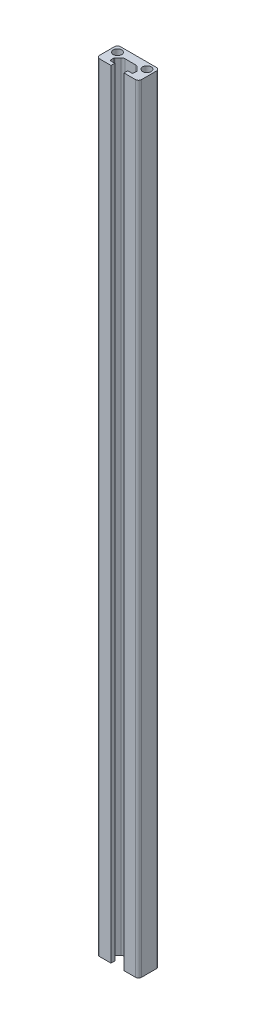
ISO-10303-21;
HEADER;
FILE_DESCRIPTION(('STEP AP214'),'2;1');
FILE_NAME('part.step','',(''),(''),'','','');
FILE_SCHEMA(('AUTOMOTIVE_DESIGN { 1 0 10303 214 1 1 1 1 }'));
ENDSEC;
DATA;
#1=APPLICATION_CONTEXT('core data for automotive mechanical design processes');
#2=APPLICATION_PROTOCOL_DEFINITION('international standard','automotive_design',2000,#1);
#3=PRODUCT_CONTEXT('',#1,'mechanical');
#4=PRODUCT('Part','Part','',(#3));
#5=PRODUCT_RELATED_PRODUCT_CATEGORY('part','',(#4));
#6=PRODUCT_DEFINITION_FORMATION('','',#4);
#7=PRODUCT_DEFINITION_CONTEXT('part definition',#1,'design');
#8=PRODUCT_DEFINITION('design','',#6,#7);
#9=PRODUCT_DEFINITION_SHAPE('','',#8);
#10=(LENGTH_UNIT() NAMED_UNIT(*) SI_UNIT(.MILLI.,.METRE.));
#11=(NAMED_UNIT(*) PLANE_ANGLE_UNIT() SI_UNIT($,.RADIAN.));
#12=(NAMED_UNIT(*) SI_UNIT($,.STERADIAN.) SOLID_ANGLE_UNIT());
#13=UNCERTAINTY_MEASURE_WITH_UNIT(LENGTH_MEASURE(1.E-05),#10,'distance_accuracy_value','');
#14=(GEOMETRIC_REPRESENTATION_CONTEXT(3) GLOBAL_UNCERTAINTY_ASSIGNED_CONTEXT((#13)) GLOBAL_UNIT_ASSIGNED_CONTEXT((#10,
#11,#12)) REPRESENTATION_CONTEXT('',''));
#15=CARTESIAN_POINT('',(0.,0.,0.));
#16=DIRECTION('',(0.,0.,1.));
#17=DIRECTION('',(1.,0.,0.));
#18=AXIS2_PLACEMENT_3D('',#15,#16,#17);
#19=CARTESIAN_POINT('',(-8.5,185.,0.));
#20=DIRECTION('',(0.,0.,-1.));
#21=DIRECTION('',(-1.,0.,0.));
#22=AXIS2_PLACEMENT_3D('',#19,#20,#21);
#23=PLANE('',#22);
#24=DIRECTION('',(1.,0.,0.));
#25=VECTOR('',#24,1.);
#26=CARTESIAN_POINT('',(-8.5,-185.,0.));
#27=LINE('',#26,#25);
#28=CARTESIAN_POINT('',(-8.5,-185.,0.));
#29=VERTEX_POINT('',#28);
#30=CARTESIAN_POINT('',(-3.1,-185.,0.));
#31=VERTEX_POINT('',#30);
#32=EDGE_CURVE('E260',#29,#31,#27,.T.);
#33=ORIENTED_EDGE('',*,*,#32,.T.);
#34=DIRECTION('',(0.,1.,0.));
#35=VECTOR('',#34,1.);
#36=CARTESIAN_POINT('',(-3.1,-185.,0.));
#37=LINE('',#36,#35);
#38=CARTESIAN_POINT('',(-3.1,185.,0.));
#39=VERTEX_POINT('',#38);
#40=EDGE_CURVE('E217',#31,#39,#37,.T.);
#41=ORIENTED_EDGE('',*,*,#40,.T.);
#42=DIRECTION('',(1.,0.,0.));
#43=VECTOR('',#42,1.);
#44=CARTESIAN_POINT('',(-8.5,185.,0.));
#45=LINE('',#44,#43);
#46=CARTESIAN_POINT('',(-8.5,185.,0.));
#47=VERTEX_POINT('',#46);
#48=EDGE_CURVE('E200',#47,#39,#45,.T.);
#49=ORIENTED_EDGE('',*,*,#48,.F.);
#50=DIRECTION('',(0.,-1.,0.));
#51=VECTOR('',#50,1.);
#52=CARTESIAN_POINT('',(-8.5,185.,0.));
#53=LINE('',#52,#51);
#54=EDGE_CURVE('E284',#47,#29,#53,.T.);
#55=ORIENTED_EDGE('',*,*,#54,.T.);
#56=EDGE_LOOP('',(#33,#41,#49,#55));
#57=FACE_BOUND('',#56,.T.);
#58=ADVANCED_FACE('F17',(#57),#23,.F.);
#59=CARTESIAN_POINT('',(-8.5,185.,-8.5));
#60=DIRECTION('',(0.,1.,0.));
#61=DIRECTION('',(0.,0.,1.));
#62=AXIS2_PLACEMENT_3D('',#59,#60,#61);
#63=PLANE('',#62);
#64=DIRECTION('',(1.,0.,0.));
#65=VECTOR('',#64,1.);
#66=CARTESIAN_POINT('',(-5.45,185.,-1.8));
#67=LINE('',#66,#65);
#68=CARTESIAN_POINT('',(-4.95,185.,-1.8));
#69=VERTEX_POINT('',#68);
#70=CARTESIAN_POINT('',(-3.1,185.,-1.8));
#71=VERTEX_POINT('',#70);
#72=EDGE_CURVE('E177',#69,#71,#67,.T.);
#73=ORIENTED_EDGE('',*,*,#72,.F.);
#74=CARTESIAN_POINT('',(-4.95,185.,-2.3));
#75=DIRECTION('',(0.,1.,0.));
#76=DIRECTION('',(0.,0.,1.));
#77=AXIS2_PLACEMENT_3D('',#74,#75,#76);
#78=CIRCLE('',#77,0.5);
#79=CARTESIAN_POINT('',(-5.45,185.,-2.3));
#80=VERTEX_POINT('',#79);
#81=EDGE_CURVE('E25',#69,#80,#78,.F.);
#82=ORIENTED_EDGE('',*,*,#81,.T.);
#83=DIRECTION('',(0.,0.,1.));
#84=VECTOR('',#83,1.);
#85=CARTESIAN_POINT('',(-5.45,185.,-3.9));
#86=LINE('',#85,#84);
#87=CARTESIAN_POINT('',(-5.45,185.,-3.69289321881346));
#88=VERTEX_POINT('',#87);
#89=EDGE_CURVE('E347',#88,#80,#86,.T.);
#90=ORIENTED_EDGE('',*,*,#89,.F.);
#91=CARTESIAN_POINT('',(-4.95,185.,-3.69289321881346));
#92=DIRECTION('',(0.,1.,0.));
#93=DIRECTION('',(0.,0.,1.));
#94=AXIS2_PLACEMENT_3D('',#91,#92,#93);
#95=CIRCLE('',#94,0.5);
#96=CARTESIAN_POINT('',(-5.30355339059327,185.,-4.04644660940673));
#97=VERTEX_POINT('',#96);
#98=EDGE_CURVE('E342',#88,#97,#95,.F.);
#99=ORIENTED_EDGE('',*,*,#98,.T.);
#100=DIRECTION('',(-0.707106781186548,0.,0.707106781186548));
#101=VECTOR('',#100,1.);
#102=CARTESIAN_POINT('',(-5.45,185.,-3.9));
#103=LINE('',#102,#101);
#104=CARTESIAN_POINT('',(-3.83578643762691,185.,-5.5142135623731));
#105=VERTEX_POINT('',#104);
#106=EDGE_CURVE('E352',#105,#97,#103,.T.);
#107=ORIENTED_EDGE('',*,*,#106,.F.);
#108=CARTESIAN_POINT('',(-2.42157287525381,185.,-4.1));
#109=DIRECTION('',(0.,1.,0.));
#110=DIRECTION('',(0.,0.,1.));
#111=AXIS2_PLACEMENT_3D('',#108,#109,#110);
#112=CIRCLE('',#111,2.);
#113=CARTESIAN_POINT('',(-2.42157287525381,185.,-6.1));
#114=VERTEX_POINT('',#113);
#115=EDGE_CURVE('E312',#105,#114,#112,.F.);
#116=ORIENTED_EDGE('',*,*,#115,.T.);
#117=DIRECTION('',(-1.,0.,0.));
#118=VECTOR('',#117,1.);
#119=CARTESIAN_POINT('',(-3.1,185.,-6.1));
#120=LINE('',#119,#118);
#121=CARTESIAN_POINT('',(2.42157287525381,185.,-6.1));
#122=VERTEX_POINT('',#121);
#123=EDGE_CURVE('E204',#122,#114,#120,.T.);
#124=ORIENTED_EDGE('',*,*,#123,.F.);
#125=CARTESIAN_POINT('',(2.42157287525381,185.,-4.1));
#126=DIRECTION('',(0.,1.,0.));
#127=DIRECTION('',(0.,0.,1.));
#128=AXIS2_PLACEMENT_3D('',#125,#126,#127);
#129=CIRCLE('',#128,2.);
#130=CARTESIAN_POINT('',(3.83578643762691,185.,-5.5142135623731));
#131=VERTEX_POINT('',#130);
#132=EDGE_CURVE('E307',#122,#131,#129,.F.);
#133=ORIENTED_EDGE('',*,*,#132,.T.);
#134=DIRECTION('',(-0.707106781186548,0.,-0.707106781186548));
#135=VECTOR('',#134,1.);
#136=CARTESIAN_POINT('',(3.25,185.,-6.1));
#137=LINE('',#136,#135);
#138=CARTESIAN_POINT('',(5.30355339059327,185.,-4.04644660940673));
#139=VERTEX_POINT('',#138);
#140=EDGE_CURVE('E441',#139,#131,#137,.T.);
#141=ORIENTED_EDGE('',*,*,#140,.F.);
#142=CARTESIAN_POINT('',(4.95,185.,-3.69289321881346));
#143=DIRECTION('',(0.,1.,0.));
#144=DIRECTION('',(0.,0.,1.));
#145=AXIS2_PLACEMENT_3D('',#142,#143,#144);
#146=CIRCLE('',#145,0.5);
#147=CARTESIAN_POINT('',(5.45,185.,-3.69289321881346));
#148=VERTEX_POINT('',#147);
#149=EDGE_CURVE('E334',#139,#148,#146,.F.);
#150=ORIENTED_EDGE('',*,*,#149,.T.);
#151=DIRECTION('',(0.,0.,-1.));
#152=VECTOR('',#151,1.);
#153=CARTESIAN_POINT('',(5.45,185.,-3.9));
#154=LINE('',#153,#152);
#155=CARTESIAN_POINT('',(5.45,185.,-2.3));
#156=VERTEX_POINT('',#155);
#157=EDGE_CURVE('E443',#156,#148,#154,.T.);
#158=ORIENTED_EDGE('',*,*,#157,.F.);
#159=CARTESIAN_POINT('',(4.95,185.,-2.3));
#160=DIRECTION('',(0.,1.,0.));
#161=DIRECTION('',(0.,0.,1.));
#162=AXIS2_PLACEMENT_3D('',#159,#160,#161);
#163=CIRCLE('',#162,0.5);
#164=CARTESIAN_POINT('',(4.95,185.,-1.8));
#165=VERTEX_POINT('',#164);
#166=EDGE_CURVE('E338',#156,#165,#163,.F.);
#167=ORIENTED_EDGE('',*,*,#166,.T.);
#168=CARTESIAN_POINT('',(3.1,185.,-1.8));
#169=VERTEX_POINT('',#168);
#170=EDGE_CURVE('E186',#169,#165,#67,.T.);
#171=ORIENTED_EDGE('',*,*,#170,.F.);
#172=DIRECTION('',(0.,0.,-1.));
#173=VECTOR('',#172,1.);
#174=CARTESIAN_POINT('',(3.1,185.,-6.1));
#175=LINE('',#174,#173);
#176=CARTESIAN_POINT('',(3.1,185.,0.));
#177=VERTEX_POINT('',#176);
#178=EDGE_CURVE('E201',#177,#169,#175,.T.);
#179=ORIENTED_EDGE('',*,*,#178,.F.);
#180=CARTESIAN_POINT('',(8.5,185.,0.));
#181=VERTEX_POINT('',#180);
#182=EDGE_CURVE('E242',#177,#181,#45,.T.);
#183=ORIENTED_EDGE('',*,*,#182,.T.);
#184=CARTESIAN_POINT('',(8.5,185.,-1.5));
#185=DIRECTION('',(0.,1.,0.));
#186=DIRECTION('',(0.,0.,1.));
#187=AXIS2_PLACEMENT_3D('',#184,#185,#186);
#188=CIRCLE('',#187,1.5);
#189=CARTESIAN_POINT('',(10.,185.,-1.5));
#190=VERTEX_POINT('',#189);
#191=EDGE_CURVE('E244',#181,#190,#188,.T.);
#192=ORIENTED_EDGE('',*,*,#191,.T.);
#193=DIRECTION('',(0.,0.,-1.));
#194=VECTOR('',#193,1.);
#195=CARTESIAN_POINT('',(10.,185.,-8.5));
#196=LINE('',#195,#194);
#197=CARTESIAN_POINT('',(10.,185.,-8.5));
#198=VERTEX_POINT('',#197);
#199=EDGE_CURVE('E246',#190,#198,#196,.T.);
#200=ORIENTED_EDGE('',*,*,#199,.T.);
#201=CARTESIAN_POINT('',(8.5,185.,-8.5));
#202=DIRECTION('',(0.,1.,0.));
#203=DIRECTION('',(0.,0.,-1.));
#204=AXIS2_PLACEMENT_3D('',#201,#202,#203);
#205=CIRCLE('',#204,1.5);
#206=CARTESIAN_POINT('',(8.5,185.,-10.));
#207=VERTEX_POINT('',#206);
#208=EDGE_CURVE('E248',#198,#207,#205,.T.);
#209=ORIENTED_EDGE('',*,*,#208,.T.);
#210=DIRECTION('',(-1.,0.,0.));
#211=VECTOR('',#210,1.);
#212=CARTESIAN_POINT('',(-8.5,185.,-10.));
#213=LINE('',#212,#211);
#214=CARTESIAN_POINT('',(-8.5,185.,-10.));
#215=VERTEX_POINT('',#214);
#216=EDGE_CURVE('E250',#207,#215,#213,.T.);
#217=ORIENTED_EDGE('',*,*,#216,.T.);
#218=CARTESIAN_POINT('',(-8.5,185.,-8.5));
#219=DIRECTION('',(0.,1.,0.));
#220=DIRECTION('',(0.,0.,1.));
#221=AXIS2_PLACEMENT_3D('',#218,#219,#220);
#222=CIRCLE('',#221,1.5);
#223=CARTESIAN_POINT('',(-10.,185.,-8.5));
#224=VERTEX_POINT('',#223);
#225=EDGE_CURVE('E234',#215,#224,#222,.T.);
#226=ORIENTED_EDGE('',*,*,#225,.T.);
#227=DIRECTION('',(0.,0.,1.));
#228=VECTOR('',#227,1.);
#229=CARTESIAN_POINT('',(-10.,185.,-8.5));
#230=LINE('',#229,#228);
#231=CARTESIAN_POINT('',(-10.,185.,-1.5));
#232=VERTEX_POINT('',#231);
#233=EDGE_CURVE('E237',#224,#232,#230,.T.);
#234=ORIENTED_EDGE('',*,*,#233,.T.);
#235=CARTESIAN_POINT('',(-8.5,185.,-1.5));
#236=DIRECTION('',(0.,1.,0.));
#237=DIRECTION('',(0.,0.,1.));
#238=AXIS2_PLACEMENT_3D('',#235,#236,#237);
#239=CIRCLE('',#238,1.5);
#240=EDGE_CURVE('E240',#232,#47,#239,.T.);
#241=ORIENTED_EDGE('',*,*,#240,.T.);
#242=ORIENTED_EDGE('',*,*,#48,.T.);
#243=DIRECTION('',(0.,0.,1.));
#244=VECTOR('',#243,1.);
#245=CARTESIAN_POINT('',(-3.1,185.,-6.1));
#246=LINE('',#245,#244);
#247=EDGE_CURVE('E191',#71,#39,#246,.T.);
#248=ORIENTED_EDGE('',*,*,#247,.F.);
#249=EDGE_LOOP('',(#73,#82,#90,#99,#107,#116,#124,#133,#141,#150,#158,#167,#171,#179,#183,#192,
#200,#209,#217,#226,#234,#241,#242,#248));
#250=FACE_BOUND('',#249,.T.);
#251=CARTESIAN_POINT('',(-7.,185.,-7.));
#252=DIRECTION('',(0.,1.,0.));
#253=DIRECTION('',(0.,0.,1.));
#254=AXIS2_PLACEMENT_3D('',#251,#252,#253);
#255=CIRCLE('',#254,2.);
#256=CARTESIAN_POINT('',(-7.,185.,-5.));
#257=VERTEX_POINT('',#256);
#258=EDGE_CURVE('E228',#257,#257,#255,.T.);
#259=ORIENTED_EDGE('',*,*,#258,.F.);
#260=EDGE_LOOP('',(#259));
#261=FACE_BOUND('',#260,.T.);
#262=CARTESIAN_POINT('',(7.,185.,-7.));
#263=DIRECTION('',(0.,1.,0.));
#264=DIRECTION('',(0.,0.,1.));
#265=AXIS2_PLACEMENT_3D('',#262,#263,#264);
#266=CIRCLE('',#265,2.);
#267=CARTESIAN_POINT('',(7.,185.,-5.));
#268=VERTEX_POINT('',#267);
#269=EDGE_CURVE('E222',#268,#268,#266,.T.);
#270=ORIENTED_EDGE('',*,*,#269,.F.);
#271=EDGE_LOOP('',(#270));
#272=FACE_BOUND('',#271,.T.);
#273=ADVANCED_FACE('F197',(#250,#261,#272),#63,.T.);
#274=CARTESIAN_POINT('',(-8.5,-185.,-8.5));
#275=DIRECTION('',(0.,1.,0.));
#276=DIRECTION('',(0.,0.,1.));
#277=AXIS2_PLACEMENT_3D('',#274,#275,#276);
#278=PLANE('',#277);
#279=DIRECTION('',(-0.707106781186548,0.,0.707106781186548));
#280=VECTOR('',#279,1.);
#281=CARTESIAN_POINT('',(-5.45,-185.,-3.9));
#282=LINE('',#281,#280);
#283=CARTESIAN_POINT('',(-3.83578643762691,-185.,-5.5142135623731));
#284=VERTEX_POINT('',#283);
#285=CARTESIAN_POINT('',(-5.30355339059327,-185.,-4.04644660940673));
#286=VERTEX_POINT('',#285);
#287=EDGE_CURVE('E433',#284,#286,#282,.T.);
#288=ORIENTED_EDGE('',*,*,#287,.T.);
#289=CARTESIAN_POINT('',(-4.95,-185.,-3.69289321881346));
#290=DIRECTION('',(0.,1.,0.));
#291=DIRECTION('',(0.,0.,1.));
#292=AXIS2_PLACEMENT_3D('',#289,#290,#291);
#293=CIRCLE('',#292,0.5);
#294=CARTESIAN_POINT('',(-5.45,-185.,-3.69289321881346));
#295=VERTEX_POINT('',#294);
#296=EDGE_CURVE('E344',#286,#295,#293,.T.);
#297=ORIENTED_EDGE('',*,*,#296,.T.);
#298=DIRECTION('',(0.,0.,1.));
#299=VECTOR('',#298,1.);
#300=CARTESIAN_POINT('',(-5.45,-185.,-3.9));
#301=LINE('',#300,#299);
#302=CARTESIAN_POINT('',(-5.45,-185.,-2.3));
#303=VERTEX_POINT('',#302);
#304=EDGE_CURVE('E430',#295,#303,#301,.T.);
#305=ORIENTED_EDGE('',*,*,#304,.T.);
#306=CARTESIAN_POINT('',(-4.95,-185.,-2.3));
#307=DIRECTION('',(0.,1.,0.));
#308=DIRECTION('',(0.,0.,1.));
#309=AXIS2_PLACEMENT_3D('',#306,#307,#308);
#310=CIRCLE('',#309,0.5);
#311=CARTESIAN_POINT('',(-4.95,-185.,-1.8));
#312=VERTEX_POINT('',#311);
#313=EDGE_CURVE('E11',#303,#312,#310,.T.);
#314=ORIENTED_EDGE('',*,*,#313,.T.);
#315=DIRECTION('',(1.,0.,0.));
#316=VECTOR('',#315,1.);
#317=CARTESIAN_POINT('',(-5.45,-185.,-1.8));
#318=LINE('',#317,#316);
#319=CARTESIAN_POINT('',(-3.1,-185.,-1.8));
#320=VERTEX_POINT('',#319);
#321=EDGE_CURVE('E194',#312,#320,#318,.T.);
#322=ORIENTED_EDGE('',*,*,#321,.T.);
#323=DIRECTION('',(0.,0.,1.));
#324=VECTOR('',#323,1.);
#325=CARTESIAN_POINT('',(-3.1,-185.,-6.1));
#326=LINE('',#325,#324);
#327=EDGE_CURVE('E193',#320,#31,#326,.T.);
#328=ORIENTED_EDGE('',*,*,#327,.T.);
#329=ORIENTED_EDGE('',*,*,#32,.F.);
#330=CARTESIAN_POINT('',(-8.5,-185.,-1.5));
#331=DIRECTION('',(0.,1.,0.));
#332=DIRECTION('',(0.,0.,1.));
#333=AXIS2_PLACEMENT_3D('',#330,#331,#332);
#334=CIRCLE('',#333,1.5);
#335=CARTESIAN_POINT('',(-10.,-185.,-1.5));
#336=VERTEX_POINT('',#335);
#337=EDGE_CURVE('E257',#336,#29,#334,.T.);
#338=ORIENTED_EDGE('',*,*,#337,.F.);
#339=DIRECTION('',(0.,0.,1.));
#340=VECTOR('',#339,1.);
#341=CARTESIAN_POINT('',(-10.,-185.,-8.5));
#342=LINE('',#341,#340);
#343=CARTESIAN_POINT('',(-10.,-185.,-8.5));
#344=VERTEX_POINT('',#343);
#345=EDGE_CURVE('E255',#344,#336,#342,.T.);
#346=ORIENTED_EDGE('',*,*,#345,.F.);
#347=CARTESIAN_POINT('',(-8.5,-185.,-8.5));
#348=DIRECTION('',(0.,1.,0.));
#349=DIRECTION('',(0.,0.,1.));
#350=AXIS2_PLACEMENT_3D('',#347,#348,#349);
#351=CIRCLE('',#350,1.5);
#352=CARTESIAN_POINT('',(-8.5,-185.,-10.));
#353=VERTEX_POINT('',#352);
#354=EDGE_CURVE('E231',#353,#344,#351,.T.);
#355=ORIENTED_EDGE('',*,*,#354,.F.);
#356=DIRECTION('',(-1.,0.,0.));
#357=VECTOR('',#356,1.);
#358=CARTESIAN_POINT('',(-8.5,-185.,-10.));
#359=LINE('',#358,#357);
#360=CARTESIAN_POINT('',(8.5,-185.,-10.));
#361=VERTEX_POINT('',#360);
#362=EDGE_CURVE('E238',#361,#353,#359,.T.);
#363=ORIENTED_EDGE('',*,*,#362,.F.);
#364=CARTESIAN_POINT('',(8.5,-185.,-8.5));
#365=DIRECTION('',(0.,1.,0.));
#366=DIRECTION('',(0.,0.,-1.));
#367=AXIS2_PLACEMENT_3D('',#364,#365,#366);
#368=CIRCLE('',#367,1.5);
#369=CARTESIAN_POINT('',(10.,-185.,-8.5));
#370=VERTEX_POINT('',#369);
#371=EDGE_CURVE('E267',#370,#361,#368,.T.);
#372=ORIENTED_EDGE('',*,*,#371,.F.);
#373=DIRECTION('',(0.,0.,-1.));
#374=VECTOR('',#373,1.);
#375=CARTESIAN_POINT('',(10.,-185.,-8.5));
#376=LINE('',#375,#374);
#377=CARTESIAN_POINT('',(10.,-185.,-1.5));
#378=VERTEX_POINT('',#377);
#379=EDGE_CURVE('E265',#378,#370,#376,.T.);
#380=ORIENTED_EDGE('',*,*,#379,.F.);
#381=CARTESIAN_POINT('',(8.5,-185.,-1.5));
#382=DIRECTION('',(0.,1.,0.));
#383=DIRECTION('',(0.,0.,1.));
#384=AXIS2_PLACEMENT_3D('',#381,#382,#383);
#385=CIRCLE('',#384,1.5);
#386=CARTESIAN_POINT('',(8.5,-185.,0.));
#387=VERTEX_POINT('',#386);
#388=EDGE_CURVE('E263',#387,#378,#385,.T.);
#389=ORIENTED_EDGE('',*,*,#388,.F.);
#390=CARTESIAN_POINT('',(3.1,-185.,0.));
#391=VERTEX_POINT('',#390);
#392=EDGE_CURVE('E259',#391,#387,#27,.T.);
#393=ORIENTED_EDGE('',*,*,#392,.F.);
#394=DIRECTION('',(0.,0.,-1.));
#395=VECTOR('',#394,1.);
#396=CARTESIAN_POINT('',(3.1,-185.,-6.1));
#397=LINE('',#396,#395);
#398=CARTESIAN_POINT('',(3.1,-185.,-1.8));
#399=VERTEX_POINT('',#398);
#400=EDGE_CURVE('E211',#391,#399,#397,.T.);
#401=ORIENTED_EDGE('',*,*,#400,.T.);
#402=CARTESIAN_POINT('',(4.95,-185.,-1.8));
#403=VERTEX_POINT('',#402);
#404=EDGE_CURVE('E402',#399,#403,#318,.T.);
#405=ORIENTED_EDGE('',*,*,#404,.T.);
#406=CARTESIAN_POINT('',(4.95,-185.,-2.3));
#407=DIRECTION('',(0.,1.,0.));
#408=DIRECTION('',(0.,0.,1.));
#409=AXIS2_PLACEMENT_3D('',#406,#407,#408);
#410=CIRCLE('',#409,0.5);
#411=CARTESIAN_POINT('',(5.45,-185.,-2.3));
#412=VERTEX_POINT('',#411);
#413=EDGE_CURVE('E340',#403,#412,#410,.T.);
#414=ORIENTED_EDGE('',*,*,#413,.T.);
#415=DIRECTION('',(0.,0.,-1.));
#416=VECTOR('',#415,1.);
#417=CARTESIAN_POINT('',(5.45,-185.,-3.9));
#418=LINE('',#417,#416);
#419=CARTESIAN_POINT('',(5.45,-185.,-3.69289321881346));
#420=VERTEX_POINT('',#419);
#421=EDGE_CURVE('E185',#412,#420,#418,.T.);
#422=ORIENTED_EDGE('',*,*,#421,.T.);
#423=CARTESIAN_POINT('',(4.95,-185.,-3.69289321881346));
#424=DIRECTION('',(0.,1.,0.));
#425=DIRECTION('',(0.,0.,1.));
#426=AXIS2_PLACEMENT_3D('',#423,#424,#425);
#427=CIRCLE('',#426,0.5);
#428=CARTESIAN_POINT('',(5.30355339059327,-185.,-4.04644660940673));
#429=VERTEX_POINT('',#428);
#430=EDGE_CURVE('E336',#420,#429,#427,.T.);
#431=ORIENTED_EDGE('',*,*,#430,.T.);
#432=DIRECTION('',(-0.707106781186548,0.,-0.707106781186548));
#433=VECTOR('',#432,1.);
#434=CARTESIAN_POINT('',(3.25,-185.,-6.1));
#435=LINE('',#434,#433);
#436=CARTESIAN_POINT('',(3.83578643762691,-185.,-5.5142135623731));
#437=VERTEX_POINT('',#436);
#438=EDGE_CURVE('E435',#429,#437,#435,.T.);
#439=ORIENTED_EDGE('',*,*,#438,.T.);
#440=CARTESIAN_POINT('',(2.42157287525381,-185.,-4.1));
#441=DIRECTION('',(0.,1.,0.));
#442=DIRECTION('',(0.,0.,1.));
#443=AXIS2_PLACEMENT_3D('',#440,#441,#442);
#444=CIRCLE('',#443,2.);
#445=CARTESIAN_POINT('',(2.42157287525381,-185.,-6.1));
#446=VERTEX_POINT('',#445);
#447=EDGE_CURVE('E310',#437,#446,#444,.T.);
#448=ORIENTED_EDGE('',*,*,#447,.T.);
#449=DIRECTION('',(-1.,0.,0.));
#450=VECTOR('',#449,1.);
#451=CARTESIAN_POINT('',(-3.1,-185.,-6.1));
#452=LINE('',#451,#450);
#453=CARTESIAN_POINT('',(-2.42157287525381,-185.,-6.1));
#454=VERTEX_POINT('',#453);
#455=EDGE_CURVE('E214',#446,#454,#452,.T.);
#456=ORIENTED_EDGE('',*,*,#455,.T.);
#457=CARTESIAN_POINT('',(-2.42157287525381,-185.,-4.1));
#458=DIRECTION('',(0.,1.,0.));
#459=DIRECTION('',(0.,0.,1.));
#460=AXIS2_PLACEMENT_3D('',#457,#458,#459);
#461=CIRCLE('',#460,2.);
#462=EDGE_CURVE('E314',#454,#284,#461,.T.);
#463=ORIENTED_EDGE('',*,*,#462,.T.);
#464=EDGE_LOOP('',(#288,#297,#305,#314,#322,#328,#329,#338,#346,#355,#363,#372,#380,#389,#393,
#401,#405,#414,#422,#431,#439,#448,#456,#463));
#465=FACE_BOUND('',#464,.T.);
#466=CARTESIAN_POINT('',(-7.,-185.,-7.));
#467=DIRECTION('',(0.,1.,0.));
#468=DIRECTION('',(0.,0.,1.));
#469=AXIS2_PLACEMENT_3D('',#466,#467,#468);
#470=CIRCLE('',#469,2.);
#471=CARTESIAN_POINT('',(-7.,-185.,-5.));
#472=VERTEX_POINT('',#471);
#473=EDGE_CURVE('E225',#472,#472,#470,.T.);
#474=ORIENTED_EDGE('',*,*,#473,.T.);
#475=EDGE_LOOP('',(#474));
#476=FACE_BOUND('',#475,.T.);
#477=CARTESIAN_POINT('',(7.,-185.,-7.));
#478=DIRECTION('',(0.,1.,0.));
#479=DIRECTION('',(0.,0.,1.));
#480=AXIS2_PLACEMENT_3D('',#477,#478,#479);
#481=CIRCLE('',#480,2.);
#482=CARTESIAN_POINT('',(7.,-185.,-5.));
#483=VERTEX_POINT('',#482);
#484=EDGE_CURVE('E220',#483,#483,#481,.T.);
#485=ORIENTED_EDGE('',*,*,#484,.T.);
#486=EDGE_LOOP('',(#485));
#487=FACE_BOUND('',#486,.T.);
#488=ADVANCED_FACE('F371',(#465,#476,#487),#278,.F.);
#489=CARTESIAN_POINT('',(-8.5,185.,-8.5));
#490=DIRECTION('',(0.,-1.,0.));
#491=DIRECTION('',(0.,0.,-1.));
#492=AXIS2_PLACEMENT_3D('',#489,#490,#491);
#493=CYLINDRICAL_SURFACE('',#492,1.5);
#494=ORIENTED_EDGE('',*,*,#354,.T.);
#495=DIRECTION('',(0.,-1.,0.));
#496=VECTOR('',#495,1.);
#497=CARTESIAN_POINT('',(-10.,185.,-8.5));
#498=LINE('',#497,#496);
#499=EDGE_CURVE('E290',#224,#344,#498,.T.);
#500=ORIENTED_EDGE('',*,*,#499,.F.);
#501=ORIENTED_EDGE('',*,*,#225,.F.);
#502=DIRECTION('',(0.,-1.,0.));
#503=VECTOR('',#502,1.);
#504=CARTESIAN_POINT('',(-8.5,185.,-10.));
#505=LINE('',#504,#503);
#506=EDGE_CURVE('E252',#215,#353,#505,.T.);
#507=ORIENTED_EDGE('',*,*,#506,.T.);
#508=EDGE_LOOP('',(#494,#500,#501,#507));
#509=FACE_BOUND('',#508,.T.);
#510=ADVANCED_FACE('F423',(#509),#493,.T.);
#511=CARTESIAN_POINT('',(-10.,185.,-8.5));
#512=DIRECTION('',(1.,0.,0.));
#513=DIRECTION('',(0.,0.,-1.));
#514=AXIS2_PLACEMENT_3D('',#511,#512,#513);
#515=PLANE('',#514);
#516=ORIENTED_EDGE('',*,*,#345,.T.);
#517=DIRECTION('',(0.,-1.,0.));
#518=VECTOR('',#517,1.);
#519=CARTESIAN_POINT('',(-10.,185.,-1.5));
#520=LINE('',#519,#518);
#521=EDGE_CURVE('E287',#232,#336,#520,.T.);
#522=ORIENTED_EDGE('',*,*,#521,.F.);
#523=ORIENTED_EDGE('',*,*,#233,.F.);
#524=ORIENTED_EDGE('',*,*,#499,.T.);
#525=EDGE_LOOP('',(#516,#522,#523,#524));
#526=FACE_BOUND('',#525,.T.);
#527=ADVANCED_FACE('F386',(#526),#515,.F.);
#528=CARTESIAN_POINT('',(-8.5,185.,-1.5));
#529=DIRECTION('',(0.,-1.,0.));
#530=DIRECTION('',(0.,0.,-1.));
#531=AXIS2_PLACEMENT_3D('',#528,#529,#530);
#532=CYLINDRICAL_SURFACE('',#531,1.5);
#533=ORIENTED_EDGE('',*,*,#337,.T.);
#534=ORIENTED_EDGE('',*,*,#54,.F.);
#535=ORIENTED_EDGE('',*,*,#240,.F.);
#536=ORIENTED_EDGE('',*,*,#521,.T.);
#537=EDGE_LOOP('',(#533,#534,#535,#536));
#538=FACE_BOUND('',#537,.T.);
#539=ADVANCED_FACE('F377',(#538),#532,.T.);
#540=ORIENTED_EDGE('',*,*,#182,.F.);
#541=DIRECTION('',(0.,1.,0.));
#542=VECTOR('',#541,1.);
#543=CARTESIAN_POINT('',(3.1,-185.,0.));
#544=LINE('',#543,#542);
#545=EDGE_CURVE('E218',#391,#177,#544,.T.);
#546=ORIENTED_EDGE('',*,*,#545,.F.);
#547=ORIENTED_EDGE('',*,*,#392,.T.);
#548=DIRECTION('',(0.,-1.,0.));
#549=VECTOR('',#548,1.);
#550=CARTESIAN_POINT('',(8.5,185.,0.));
#551=LINE('',#550,#549);
#552=EDGE_CURVE('E281',#181,#387,#551,.T.);
#553=ORIENTED_EDGE('',*,*,#552,.F.);
#554=EDGE_LOOP('',(#540,#546,#547,#553));
#555=FACE_BOUND('',#554,.T.);
#556=ADVANCED_FACE('F366',(#555),#23,.F.);
#557=CARTESIAN_POINT('',(8.5,185.,-1.5));
#558=DIRECTION('',(0.,-1.,0.));
#559=DIRECTION('',(0.,0.,-1.));
#560=AXIS2_PLACEMENT_3D('',#557,#558,#559);
#561=CYLINDRICAL_SURFACE('',#560,1.5);
#562=ORIENTED_EDGE('',*,*,#388,.T.);
#563=DIRECTION('',(0.,-1.,0.));
#564=VECTOR('',#563,1.);
#565=CARTESIAN_POINT('',(10.,185.,-1.5));
#566=LINE('',#565,#564);
#567=EDGE_CURVE('E278',#190,#378,#566,.T.);
#568=ORIENTED_EDGE('',*,*,#567,.F.);
#569=ORIENTED_EDGE('',*,*,#191,.F.);
#570=ORIENTED_EDGE('',*,*,#552,.T.);
#571=EDGE_LOOP('',(#562,#568,#569,#570));
#572=FACE_BOUND('',#571,.T.);
#573=ADVANCED_FACE('F376',(#572),#561,.T.);
#574=CARTESIAN_POINT('',(10.,185.,-8.5));
#575=DIRECTION('',(-1.,0.,0.));
#576=DIRECTION('',(0.,0.,1.));
#577=AXIS2_PLACEMENT_3D('',#574,#575,#576);
#578=PLANE('',#577);
#579=ORIENTED_EDGE('',*,*,#379,.T.);
#580=DIRECTION('',(0.,-1.,0.));
#581=VECTOR('',#580,1.);
#582=CARTESIAN_POINT('',(10.,185.,-8.5));
#583=LINE('',#582,#581);
#584=EDGE_CURVE('E275',#198,#370,#583,.T.);
#585=ORIENTED_EDGE('',*,*,#584,.F.);
#586=ORIENTED_EDGE('',*,*,#199,.F.);
#587=ORIENTED_EDGE('',*,*,#567,.T.);
#588=EDGE_LOOP('',(#579,#585,#586,#587));
#589=FACE_BOUND('',#588,.T.);
#590=ADVANCED_FACE('F384',(#589),#578,.F.);
#591=CARTESIAN_POINT('',(8.5,185.,-8.5));
#592=DIRECTION('',(0.,-1.,0.));
#593=DIRECTION('',(0.,0.,-1.));
#594=AXIS2_PLACEMENT_3D('',#591,#592,#593);
#595=CYLINDRICAL_SURFACE('',#594,1.5);
#596=ORIENTED_EDGE('',*,*,#371,.T.);
#597=DIRECTION('',(0.,-1.,0.));
#598=VECTOR('',#597,1.);
#599=CARTESIAN_POINT('',(8.5,185.,-10.));
#600=LINE('',#599,#598);
#601=EDGE_CURVE('E272',#207,#361,#600,.T.);
#602=ORIENTED_EDGE('',*,*,#601,.F.);
#603=ORIENTED_EDGE('',*,*,#208,.F.);
#604=ORIENTED_EDGE('',*,*,#584,.T.);
#605=EDGE_LOOP('',(#596,#602,#603,#604));
#606=FACE_BOUND('',#605,.T.);
#607=ADVANCED_FACE('F414',(#606),#595,.T.);
#608=CARTESIAN_POINT('',(-8.5,185.,-10.));
#609=DIRECTION('',(0.,0.,1.));
#610=DIRECTION('',(1.,0.,0.));
#611=AXIS2_PLACEMENT_3D('',#608,#609,#610);
#612=PLANE('',#611);
#613=ORIENTED_EDGE('',*,*,#362,.T.);
#614=ORIENTED_EDGE('',*,*,#506,.F.);
#615=ORIENTED_EDGE('',*,*,#216,.F.);
#616=ORIENTED_EDGE('',*,*,#601,.T.);
#617=EDGE_LOOP('',(#613,#614,#615,#616));
#618=FACE_BOUND('',#617,.T.);
#619=ADVANCED_FACE('F418',(#618),#612,.F.);
#620=CARTESIAN_POINT('',(-7.,185.,-7.));
#621=DIRECTION('',(0.,-1.,0.));
#622=DIRECTION('',(0.,0.,-1.));
#623=AXIS2_PLACEMENT_3D('',#620,#621,#622);
#624=CYLINDRICAL_SURFACE('',#623,2.);
#625=ORIENTED_EDGE('',*,*,#258,.T.);
#626=EDGE_LOOP('',(#625));
#627=FACE_BOUND('',#626,.T.);
#628=ORIENTED_EDGE('',*,*,#473,.F.);
#629=EDGE_LOOP('',(#628));
#630=FACE_BOUND('',#629,.T.);
#631=ADVANCED_FACE('F504',(#627,#630),#624,.F.);
#632=CARTESIAN_POINT('',(7.,185.,-7.));
#633=DIRECTION('',(0.,-1.,0.));
#634=DIRECTION('',(0.,0.,-1.));
#635=AXIS2_PLACEMENT_3D('',#632,#633,#634);
#636=CYLINDRICAL_SURFACE('',#635,2.);
#637=ORIENTED_EDGE('',*,*,#269,.T.);
#638=EDGE_LOOP('',(#637));
#639=FACE_BOUND('',#638,.T.);
#640=ORIENTED_EDGE('',*,*,#484,.F.);
#641=EDGE_LOOP('',(#640));
#642=FACE_BOUND('',#641,.T.);
#643=ADVANCED_FACE('F501',(#639,#642),#636,.F.);
#644=CARTESIAN_POINT('',(-3.1,-185.,-6.1));
#645=DIRECTION('',(-1.,0.,0.));
#646=DIRECTION('',(0.,0.,1.));
#647=AXIS2_PLACEMENT_3D('',#644,#645,#646);
#648=PLANE('',#647);
#649=ORIENTED_EDGE('',*,*,#327,.F.);
#650=DIRECTION('',(0.,1.,0.));
#651=VECTOR('',#650,1.);
#652=CARTESIAN_POINT('',(-3.1,-185.,-1.8));
#653=LINE('',#652,#651);
#654=EDGE_CURVE('E180',#320,#71,#653,.T.);
#655=ORIENTED_EDGE('',*,*,#654,.T.);
#656=ORIENTED_EDGE('',*,*,#247,.T.);
#657=ORIENTED_EDGE('',*,*,#40,.F.);
#658=EDGE_LOOP('',(#649,#655,#656,#657));
#659=FACE_BOUND('',#658,.T.);
#660=ADVANCED_FACE('F189',(#659),#648,.F.);
#661=CARTESIAN_POINT('',(-3.1,-185.,-6.1));
#662=DIRECTION('',(0.,0.,-1.));
#663=DIRECTION('',(-1.,0.,0.));
#664=AXIS2_PLACEMENT_3D('',#661,#662,#663);
#665=PLANE('',#664);
#666=ORIENTED_EDGE('',*,*,#455,.F.);
#667=DIRECTION('',(0.,1.,0.));
#668=VECTOR('',#667,1.);
#669=CARTESIAN_POINT('',(2.42157287525381,185.,-6.1));
#670=LINE('',#669,#668);
#671=EDGE_CURVE('E298',#446,#122,#670,.T.);
#672=ORIENTED_EDGE('',*,*,#671,.T.);
#673=ORIENTED_EDGE('',*,*,#123,.T.);
#674=DIRECTION('',(0.,1.,0.));
#675=VECTOR('',#674,1.);
#676=CARTESIAN_POINT('',(-2.42157287525381,-185.,-6.1));
#677=LINE('',#676,#675);
#678=EDGE_CURVE('E296',#114,#454,#677,.F.);
#679=ORIENTED_EDGE('',*,*,#678,.T.);
#680=EDGE_LOOP('',(#666,#672,#673,#679));
#681=FACE_BOUND('',#680,.T.);
#682=ADVANCED_FACE('F467',(#681),#665,.F.);
#683=CARTESIAN_POINT('',(3.1,-185.,-6.1));
#684=DIRECTION('',(1.,0.,0.));
#685=DIRECTION('',(0.,0.,-1.));
#686=AXIS2_PLACEMENT_3D('',#683,#684,#685);
#687=PLANE('',#686);
#688=ORIENTED_EDGE('',*,*,#178,.T.);
#689=DIRECTION('',(0.,-1.,0.));
#690=VECTOR('',#689,1.);
#691=CARTESIAN_POINT('',(3.1,-185.,-1.8));
#692=LINE('',#691,#690);
#693=EDGE_CURVE('E293',#169,#399,#692,.T.);
#694=ORIENTED_EDGE('',*,*,#693,.T.);
#695=ORIENTED_EDGE('',*,*,#400,.F.);
#696=ORIENTED_EDGE('',*,*,#545,.T.);
#697=EDGE_LOOP('',(#688,#694,#695,#696));
#698=FACE_BOUND('',#697,.T.);
#699=ADVANCED_FACE('F398',(#698),#687,.F.);
#700=CARTESIAN_POINT('',(-5.45,-185.,-1.8));
#701=DIRECTION('',(0.,0.,1.));
#702=DIRECTION('',(1.,0.,0.));
#703=AXIS2_PLACEMENT_3D('',#700,#701,#702);
#704=PLANE('',#703);
#705=ORIENTED_EDGE('',*,*,#170,.T.);
#706=DIRECTION('',(0.,1.,0.));
#707=VECTOR('',#706,1.);
#708=CARTESIAN_POINT('',(4.95,-185.,-1.8));
#709=LINE('',#708,#707);
#710=EDGE_CURVE('E324',#165,#403,#709,.F.);
#711=ORIENTED_EDGE('',*,*,#710,.T.);
#712=ORIENTED_EDGE('',*,*,#404,.F.);
#713=ORIENTED_EDGE('',*,*,#693,.F.);
#714=EDGE_LOOP('',(#705,#711,#712,#713));
#715=FACE_BOUND('',#714,.T.);
#716=ADVANCED_FACE('F492',(#715),#704,.F.);
#717=CARTESIAN_POINT('',(3.25,-185.,-6.1));
#718=DIRECTION('',(0.707106781186547,0.,-0.707106781186548));
#719=DIRECTION('',(-0.707106781186548,0.,-0.707106781186548));
#720=AXIS2_PLACEMENT_3D('',#717,#718,#719);
#721=PLANE('',#720);
#722=ORIENTED_EDGE('',*,*,#438,.F.);
#723=DIRECTION('',(0.,1.,0.));
#724=VECTOR('',#723,1.);
#725=CARTESIAN_POINT('',(5.30355339059327,185.,-4.04644660940673));
#726=LINE('',#725,#724);
#727=EDGE_CURVE('E316',#429,#139,#726,.T.);
#728=ORIENTED_EDGE('',*,*,#727,.T.);
#729=ORIENTED_EDGE('',*,*,#140,.T.);
#730=DIRECTION('',(0.,1.,0.));
#731=VECTOR('',#730,1.);
#732=CARTESIAN_POINT('',(3.83578643762691,-185.,-5.5142135623731));
#733=LINE('',#732,#731);
#734=EDGE_CURVE('E301',#131,#437,#733,.F.);
#735=ORIENTED_EDGE('',*,*,#734,.T.);
#736=EDGE_LOOP('',(#722,#728,#729,#735));
#737=FACE_BOUND('',#736,.T.);
#738=ADVANCED_FACE('F457',(#737),#721,.F.);
#739=CARTESIAN_POINT('',(5.45,-185.,-3.9));
#740=DIRECTION('',(1.,0.,0.));
#741=DIRECTION('',(0.,0.,-1.));
#742=AXIS2_PLACEMENT_3D('',#739,#740,#741);
#743=PLANE('',#742);
#744=ORIENTED_EDGE('',*,*,#157,.T.);
#745=DIRECTION('',(0.,1.,0.));
#746=VECTOR('',#745,1.);
#747=CARTESIAN_POINT('',(5.45,-185.,-3.69289321881346));
#748=LINE('',#747,#746);
#749=EDGE_CURVE('E322',#148,#420,#748,.F.);
#750=ORIENTED_EDGE('',*,*,#749,.T.);
#751=ORIENTED_EDGE('',*,*,#421,.F.);
#752=DIRECTION('',(0.,1.,0.));
#753=VECTOR('',#752,1.);
#754=CARTESIAN_POINT('',(5.45,185.,-2.3));
#755=LINE('',#754,#753);
#756=EDGE_CURVE('E319',#412,#156,#755,.T.);
#757=ORIENTED_EDGE('',*,*,#756,.T.);
#758=EDGE_LOOP('',(#744,#750,#751,#757));
#759=FACE_BOUND('',#758,.T.);
#760=ADVANCED_FACE('F448',(#759),#743,.F.);
#761=ORIENTED_EDGE('',*,*,#321,.F.);
#762=DIRECTION('',(0.,1.,0.));
#763=VECTOR('',#762,1.);
#764=CARTESIAN_POINT('',(-4.95,185.,-1.8));
#765=LINE('',#764,#763);
#766=EDGE_CURVE('E182',#312,#69,#765,.T.);
#767=ORIENTED_EDGE('',*,*,#766,.T.);
#768=ORIENTED_EDGE('',*,*,#72,.T.);
#769=ORIENTED_EDGE('',*,*,#654,.F.);
#770=EDGE_LOOP('',(#761,#767,#768,#769));
#771=FACE_BOUND('',#770,.T.);
#772=ADVANCED_FACE('F179',(#771),#704,.F.);
#773=CARTESIAN_POINT('',(-5.45,-185.,-3.9));
#774=DIRECTION('',(-1.,0.,0.));
#775=DIRECTION('',(0.,0.,1.));
#776=AXIS2_PLACEMENT_3D('',#773,#774,#775);
#777=PLANE('',#776);
#778=ORIENTED_EDGE('',*,*,#304,.F.);
#779=DIRECTION('',(0.,1.,0.));
#780=VECTOR('',#779,1.);
#781=CARTESIAN_POINT('',(-5.45,185.,-3.69289321881346));
#782=LINE('',#781,#780);
#783=EDGE_CURVE('E328',#295,#88,#782,.T.);
#784=ORIENTED_EDGE('',*,*,#783,.T.);
#785=ORIENTED_EDGE('',*,*,#89,.T.);
#786=DIRECTION('',(0.,1.,0.));
#787=VECTOR('',#786,1.);
#788=CARTESIAN_POINT('',(-5.45,-185.,-2.3));
#789=LINE('',#788,#787);
#790=EDGE_CURVE('E326',#80,#303,#789,.F.);
#791=ORIENTED_EDGE('',*,*,#790,.T.);
#792=EDGE_LOOP('',(#778,#784,#785,#791));
#793=FACE_BOUND('',#792,.T.);
#794=ADVANCED_FACE('F350',(#793),#777,.F.);
#795=CARTESIAN_POINT('',(-5.45,-185.,-3.9));
#796=DIRECTION('',(-0.707106781186547,0.,-0.707106781186548));
#797=DIRECTION('',(-0.707106781186548,0.,0.707106781186548));
#798=AXIS2_PLACEMENT_3D('',#795,#796,#797);
#799=PLANE('',#798);
#800=ORIENTED_EDGE('',*,*,#106,.T.);
#801=DIRECTION('',(0.,1.,0.));
#802=VECTOR('',#801,1.);
#803=CARTESIAN_POINT('',(-5.30355339059327,-185.,-4.04644660940673));
#804=LINE('',#803,#802);
#805=EDGE_CURVE('E331',#97,#286,#804,.F.);
#806=ORIENTED_EDGE('',*,*,#805,.T.);
#807=ORIENTED_EDGE('',*,*,#287,.F.);
#808=DIRECTION('',(0.,1.,0.));
#809=VECTOR('',#808,1.);
#810=CARTESIAN_POINT('',(-3.83578643762691,185.,-5.5142135623731));
#811=LINE('',#810,#809);
#812=EDGE_CURVE('E304',#284,#105,#811,.T.);
#813=ORIENTED_EDGE('',*,*,#812,.T.);
#814=EDGE_LOOP('',(#800,#806,#807,#813));
#815=FACE_BOUND('',#814,.T.);
#816=ADVANCED_FACE('F476',(#815),#799,.F.);
#817=CARTESIAN_POINT('',(2.42157287525381,-185.,-4.1));
#818=DIRECTION('',(0.,-1.,0.));
#819=DIRECTION('',(0.,0.,-1.));
#820=AXIS2_PLACEMENT_3D('',#817,#818,#819);
#821=CYLINDRICAL_SURFACE('',#820,2.);
#822=ORIENTED_EDGE('',*,*,#447,.F.);
#823=ORIENTED_EDGE('',*,*,#734,.F.);
#824=ORIENTED_EDGE('',*,*,#132,.F.);
#825=ORIENTED_EDGE('',*,*,#671,.F.);
#826=EDGE_LOOP('',(#822,#823,#824,#825));
#827=FACE_BOUND('',#826,.T.);
#828=ADVANCED_FACE('F463',(#827),#821,.F.);
#829=CARTESIAN_POINT('',(-2.42157287525381,-185.,-4.1));
#830=DIRECTION('',(0.,-1.,0.));
#831=DIRECTION('',(0.,0.,-1.));
#832=AXIS2_PLACEMENT_3D('',#829,#830,#831);
#833=CYLINDRICAL_SURFACE('',#832,2.);
#834=ORIENTED_EDGE('',*,*,#462,.F.);
#835=ORIENTED_EDGE('',*,*,#678,.F.);
#836=ORIENTED_EDGE('',*,*,#115,.F.);
#837=ORIENTED_EDGE('',*,*,#812,.F.);
#838=EDGE_LOOP('',(#834,#835,#836,#837));
#839=FACE_BOUND('',#838,.T.);
#840=ADVANCED_FACE('F471',(#839),#833,.F.);
#841=CARTESIAN_POINT('',(4.95,-185.,-3.69289321881346));
#842=DIRECTION('',(0.,-1.,0.));
#843=DIRECTION('',(0.,0.,-1.));
#844=AXIS2_PLACEMENT_3D('',#841,#842,#843);
#845=CYLINDRICAL_SURFACE('',#844,0.5);
#846=ORIENTED_EDGE('',*,*,#430,.F.);
#847=ORIENTED_EDGE('',*,*,#749,.F.);
#848=ORIENTED_EDGE('',*,*,#149,.F.);
#849=ORIENTED_EDGE('',*,*,#727,.F.);
#850=EDGE_LOOP('',(#846,#847,#848,#849));
#851=FACE_BOUND('',#850,.T.);
#852=ADVANCED_FACE('F453',(#851),#845,.F.);
#853=CARTESIAN_POINT('',(4.95,-185.,-2.3));
#854=DIRECTION('',(0.,-1.,0.));
#855=DIRECTION('',(0.,0.,-1.));
#856=AXIS2_PLACEMENT_3D('',#853,#854,#855);
#857=CYLINDRICAL_SURFACE('',#856,0.5);
#858=ORIENTED_EDGE('',*,*,#413,.F.);
#859=ORIENTED_EDGE('',*,*,#710,.F.);
#860=ORIENTED_EDGE('',*,*,#166,.F.);
#861=ORIENTED_EDGE('',*,*,#756,.F.);
#862=EDGE_LOOP('',(#858,#859,#860,#861));
#863=FACE_BOUND('',#862,.T.);
#864=ADVANCED_FACE('F361',(#863),#857,.F.);
#865=CARTESIAN_POINT('',(-4.95,-185.,-3.69289321881346));
#866=DIRECTION('',(0.,-1.,0.));
#867=DIRECTION('',(0.,0.,-1.));
#868=AXIS2_PLACEMENT_3D('',#865,#866,#867);
#869=CYLINDRICAL_SURFACE('',#868,0.5);
#870=ORIENTED_EDGE('',*,*,#296,.F.);
#871=ORIENTED_EDGE('',*,*,#805,.F.);
#872=ORIENTED_EDGE('',*,*,#98,.F.);
#873=ORIENTED_EDGE('',*,*,#783,.F.);
#874=EDGE_LOOP('',(#870,#871,#872,#873));
#875=FACE_BOUND('',#874,.T.);
#876=ADVANCED_FACE('F355',(#875),#869,.F.);
#877=CARTESIAN_POINT('',(-4.95,-185.,-2.3));
#878=DIRECTION('',(0.,-1.,0.));
#879=DIRECTION('',(0.,0.,-1.));
#880=AXIS2_PLACEMENT_3D('',#877,#878,#879);
#881=CYLINDRICAL_SURFACE('',#880,0.5);
#882=ORIENTED_EDGE('',*,*,#313,.F.);
#883=ORIENTED_EDGE('',*,*,#790,.F.);
#884=ORIENTED_EDGE('',*,*,#81,.F.);
#885=ORIENTED_EDGE('',*,*,#766,.F.);
#886=EDGE_LOOP('',(#882,#883,#884,#885));
#887=FACE_BOUND('',#886,.T.);
#888=ADVANCED_FACE('F19',(#887),#881,.F.);
#889=CLOSED_SHELL('',(#58,#273,#488,#510,#527,#539,#556,#573,#590,#607,#619,#631,#643,#660,#682,
#699,#716,#738,#760,#772,#794,#816,#828,#840,#852,#864,#876,#888));
#890=MANIFOLD_SOLID_BREP('B1',#889);
#891=ADVANCED_BREP_SHAPE_REPRESENTATION('',(#18,#890),#14);
#892=SHAPE_DEFINITION_REPRESENTATION(#9,#891);
ENDSEC;
END-ISO-10303-21;
